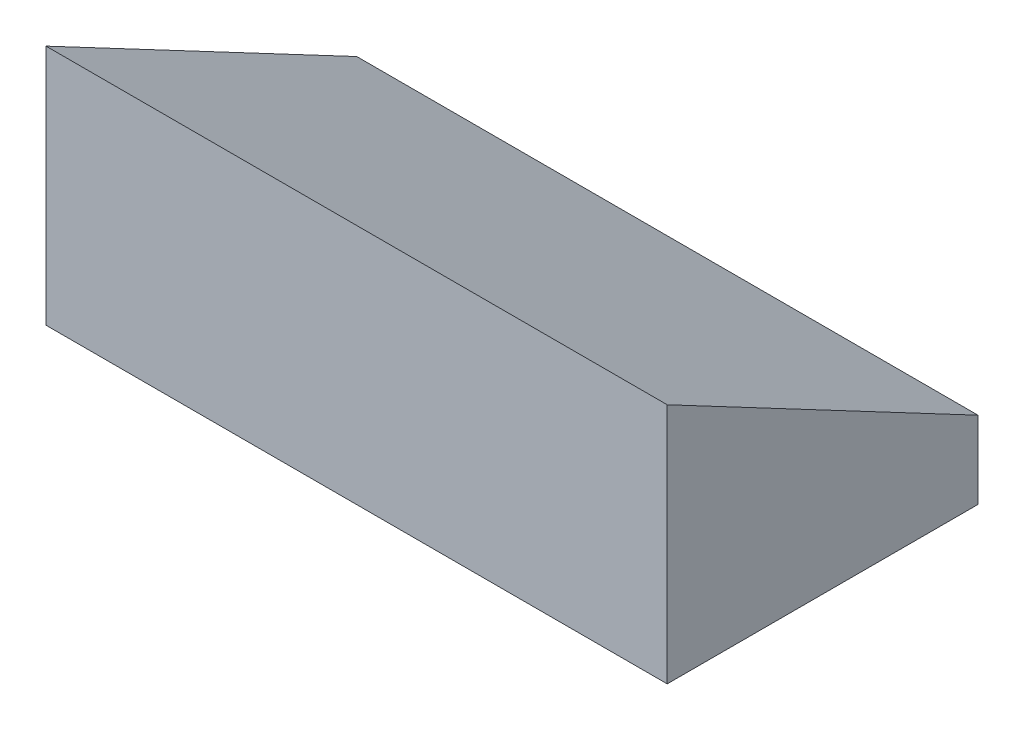
ISO-10303-21;
HEADER;
FILE_DESCRIPTION(('STEP AP214'),'2;1');
FILE_NAME('part.step','',(''),(''),'','','');
FILE_SCHEMA(('AUTOMOTIVE_DESIGN { 1 0 10303 214 1 1 1 1 }'));
ENDSEC;
DATA;
#1=APPLICATION_CONTEXT('core data for automotive mechanical design processes');
#2=APPLICATION_PROTOCOL_DEFINITION('international standard','automotive_design',2000,#1);
#3=PRODUCT_CONTEXT('',#1,'mechanical');
#4=PRODUCT('Part','Part','',(#3));
#5=PRODUCT_RELATED_PRODUCT_CATEGORY('part','',(#4));
#6=PRODUCT_DEFINITION_FORMATION('','',#4);
#7=PRODUCT_DEFINITION_CONTEXT('part definition',#1,'design');
#8=PRODUCT_DEFINITION('design','',#6,#7);
#9=PRODUCT_DEFINITION_SHAPE('','',#8);
#10=(LENGTH_UNIT() NAMED_UNIT(*) SI_UNIT(.MILLI.,.METRE.));
#11=(NAMED_UNIT(*) PLANE_ANGLE_UNIT() SI_UNIT($,.RADIAN.));
#12=(NAMED_UNIT(*) SI_UNIT($,.STERADIAN.) SOLID_ANGLE_UNIT());
#13=UNCERTAINTY_MEASURE_WITH_UNIT(LENGTH_MEASURE(1.E-05),#10,'distance_accuracy_value','');
#14=(GEOMETRIC_REPRESENTATION_CONTEXT(3) GLOBAL_UNCERTAINTY_ASSIGNED_CONTEXT((#13)) GLOBAL_UNIT_ASSIGNED_CONTEXT((#10,
#11,#12)) REPRESENTATION_CONTEXT('',''));
#15=CARTESIAN_POINT('',(0.,0.,0.));
#16=DIRECTION('',(0.,0.,1.));
#17=DIRECTION('',(1.,0.,0.));
#18=AXIS2_PLACEMENT_3D('',#15,#16,#17);
#19=CARTESIAN_POINT('',(15.83,0.,0.));
#20=DIRECTION('',(0.,1.,0.));
#21=DIRECTION('',(0.,0.,1.));
#22=AXIS2_PLACEMENT_3D('',#19,#20,#21);
#23=PLANE('',#22);
#24=DIRECTION('',(0.,0.,-1.));
#25=VECTOR('',#24,1.);
#26=CARTESIAN_POINT('',(0.,0.,0.));
#27=LINE('',#26,#25);
#28=CARTESIAN_POINT('',(0.,0.,0.));
#29=VERTEX_POINT('',#28);
#30=CARTESIAN_POINT('',(0.,0.,-7.92));
#31=VERTEX_POINT('',#30);
#32=EDGE_CURVE('E143',#29,#31,#27,.T.);
#33=ORIENTED_EDGE('',*,*,#32,.T.);
#34=DIRECTION('',(-1.,0.,0.));
#35=VECTOR('',#34,1.);
#36=CARTESIAN_POINT('',(15.83,0.,-7.92));
#37=LINE('',#36,#35);
#38=CARTESIAN_POINT('',(15.83,0.,-7.92));
#39=VERTEX_POINT('',#38);
#40=EDGE_CURVE('E40',#39,#31,#37,.T.);
#41=ORIENTED_EDGE('',*,*,#40,.F.);
#42=DIRECTION('',(0.,0.,-1.));
#43=VECTOR('',#42,1.);
#44=CARTESIAN_POINT('',(15.83,0.,0.));
#45=LINE('',#44,#43);
#46=CARTESIAN_POINT('',(15.83,0.,0.));
#47=VERTEX_POINT('',#46);
#48=EDGE_CURVE('E149',#47,#39,#45,.T.);
#49=ORIENTED_EDGE('',*,*,#48,.F.);
#50=DIRECTION('',(-1.,0.,0.));
#51=VECTOR('',#50,1.);
#52=CARTESIAN_POINT('',(15.83,0.,0.));
#53=LINE('',#52,#51);
#54=EDGE_CURVE('E155',#47,#29,#53,.T.);
#55=ORIENTED_EDGE('',*,*,#54,.T.);
#56=EDGE_LOOP('',(#33,#41,#49,#55));
#57=FACE_BOUND('',#56,.T.);
#58=DIRECTION('',(0.,0.,-1.));
#59=VECTOR('',#58,1.);
#60=CARTESIAN_POINT('',(1.5,0.,0.));
#61=LINE('',#60,#59);
#62=CARTESIAN_POINT('',(1.5,0.,-1.5));
#63=VERTEX_POINT('',#62);
#64=CARTESIAN_POINT('',(1.5,0.,-6.42));
#65=VERTEX_POINT('',#64);
#66=EDGE_CURVE('E114',#63,#65,#61,.T.);
#67=ORIENTED_EDGE('',*,*,#66,.F.);
#68=DIRECTION('',(-1.,0.,0.));
#69=VECTOR('',#68,1.);
#70=CARTESIAN_POINT('',(15.83,0.,-1.5));
#71=LINE('',#70,#69);
#72=CARTESIAN_POINT('',(14.33,0.,-1.5));
#73=VERTEX_POINT('',#72);
#74=EDGE_CURVE('E137',#73,#63,#71,.T.);
#75=ORIENTED_EDGE('',*,*,#74,.F.);
#76=DIRECTION('',(0.,0.,-1.));
#77=VECTOR('',#76,1.);
#78=CARTESIAN_POINT('',(14.33,0.,0.));
#79=LINE('',#78,#77);
#80=CARTESIAN_POINT('',(14.33,0.,-6.42));
#81=VERTEX_POINT('',#80);
#82=EDGE_CURVE('E47',#73,#81,#79,.T.);
#83=ORIENTED_EDGE('',*,*,#82,.T.);
#84=DIRECTION('',(-1.,0.,0.));
#85=VECTOR('',#84,1.);
#86=CARTESIAN_POINT('',(15.83,0.,-6.42));
#87=LINE('',#86,#85);
#88=EDGE_CURVE('E125',#81,#65,#87,.T.);
#89=ORIENTED_EDGE('',*,*,#88,.T.);
#90=EDGE_LOOP('',(#67,#75,#83,#89));
#91=FACE_BOUND('',#90,.T.);
#92=ADVANCED_FACE('F33',(#57,#91),#23,.F.);
#93=CARTESIAN_POINT('',(15.83,0.,-7.92));
#94=DIRECTION('',(0.,0.,1.));
#95=DIRECTION('',(1.,0.,0.));
#96=AXIS2_PLACEMENT_3D('',#93,#94,#95);
#97=PLANE('',#96);
#98=DIRECTION('',(0.,1.,0.));
#99=VECTOR('',#98,1.);
#100=CARTESIAN_POINT('',(0.,0.,-7.92));
#101=LINE('',#100,#99);
#102=CARTESIAN_POINT('',(0.,1.97,-7.92));
#103=VERTEX_POINT('',#102);
#104=EDGE_CURVE('E158',#31,#103,#101,.T.);
#105=ORIENTED_EDGE('',*,*,#104,.T.);
#106=DIRECTION('',(-1.,0.,0.));
#107=VECTOR('',#106,1.);
#108=CARTESIAN_POINT('',(15.83,1.97,-7.92));
#109=LINE('',#108,#107);
#110=CARTESIAN_POINT('',(15.83,1.97,-7.92));
#111=VERTEX_POINT('',#110);
#112=EDGE_CURVE('E166',#111,#103,#109,.T.);
#113=ORIENTED_EDGE('',*,*,#112,.F.);
#114=DIRECTION('',(0.,1.,0.));
#115=VECTOR('',#114,1.);
#116=CARTESIAN_POINT('',(15.83,0.,-7.92));
#117=LINE('',#116,#115);
#118=EDGE_CURVE('E85',#39,#111,#117,.T.);
#119=ORIENTED_EDGE('',*,*,#118,.F.);
#120=ORIENTED_EDGE('',*,*,#40,.T.);
#121=EDGE_LOOP('',(#105,#113,#119,#120));
#122=FACE_BOUND('',#121,.T.);
#123=ADVANCED_FACE('F169',(#122),#97,.F.);
#124=CARTESIAN_POINT('',(15.83,1.97,-7.92));
#125=DIRECTION('',(0.,-0.883923616812411,0.467631307379293));
#126=DIRECTION('',(0.,-0.467631307379293,-0.883923616812411));
#127=AXIS2_PLACEMENT_3D('',#124,#125,#126);
#128=PLANE('',#127);
#129=DIRECTION('',(0.,0.467631307379293,0.883923616812411));
#130=VECTOR('',#129,1.);
#131=CARTESIAN_POINT('',(0.,1.97,-7.92));
#132=LINE('',#131,#130);
#133=CARTESIAN_POINT('',(0.,6.16,0.));
#134=VERTEX_POINT('',#133);
#135=EDGE_CURVE('E160',#103,#134,#132,.T.);
#136=ORIENTED_EDGE('',*,*,#135,.T.);
#137=DIRECTION('',(-1.,0.,0.));
#138=VECTOR('',#137,1.);
#139=CARTESIAN_POINT('',(15.83,6.16,0.));
#140=LINE('',#139,#138);
#141=CARTESIAN_POINT('',(15.83,6.16,0.));
#142=VERTEX_POINT('',#141);
#143=EDGE_CURVE('E164',#142,#134,#140,.T.);
#144=ORIENTED_EDGE('',*,*,#143,.F.);
#145=DIRECTION('',(0.,0.467631307379293,0.883923616812411));
#146=VECTOR('',#145,1.);
#147=CARTESIAN_POINT('',(15.83,1.97,-7.92));
#148=LINE('',#147,#146);
#149=EDGE_CURVE('E152',#111,#142,#148,.T.);
#150=ORIENTED_EDGE('',*,*,#149,.F.);
#151=ORIENTED_EDGE('',*,*,#112,.T.);
#152=EDGE_LOOP('',(#136,#144,#150,#151));
#153=FACE_BOUND('',#152,.T.);
#154=ADVANCED_FACE('F179',(#153),#128,.F.);
#155=CARTESIAN_POINT('',(15.83,0.,0.));
#156=DIRECTION('',(0.,0.,-1.));
#157=DIRECTION('',(-1.,0.,0.));
#158=AXIS2_PLACEMENT_3D('',#155,#156,#157);
#159=PLANE('',#158);
#160=DIRECTION('',(0.,-1.,0.));
#161=VECTOR('',#160,1.);
#162=CARTESIAN_POINT('',(0.,0.,0.));
#163=LINE('',#162,#161);
#164=EDGE_CURVE('E77',#134,#29,#163,.T.);
#165=ORIENTED_EDGE('',*,*,#164,.T.);
#166=ORIENTED_EDGE('',*,*,#54,.F.);
#167=DIRECTION('',(0.,-1.,0.));
#168=VECTOR('',#167,1.);
#169=CARTESIAN_POINT('',(15.83,0.,0.));
#170=LINE('',#169,#168);
#171=EDGE_CURVE('E56',#142,#47,#170,.T.);
#172=ORIENTED_EDGE('',*,*,#171,.F.);
#173=ORIENTED_EDGE('',*,*,#143,.T.);
#174=EDGE_LOOP('',(#165,#166,#172,#173));
#175=FACE_BOUND('',#174,.T.);
#176=ADVANCED_FACE('F181',(#175),#159,.F.);
#177=CARTESIAN_POINT('',(15.83,0.,0.));
#178=DIRECTION('',(1.,0.,0.));
#179=DIRECTION('',(0.,0.,-1.));
#180=AXIS2_PLACEMENT_3D('',#177,#178,#179);
#181=PLANE('',#180);
#182=ORIENTED_EDGE('',*,*,#48,.T.);
#183=ORIENTED_EDGE('',*,*,#118,.T.);
#184=ORIENTED_EDGE('',*,*,#149,.T.);
#185=ORIENTED_EDGE('',*,*,#171,.T.);
#186=EDGE_LOOP('',(#182,#183,#184,#185));
#187=FACE_BOUND('',#186,.T.);
#188=ADVANCED_FACE('F182',(#187),#181,.T.);
#189=CARTESIAN_POINT('',(0.,0.,0.));
#190=DIRECTION('',(1.,0.,0.));
#191=DIRECTION('',(0.,0.,-1.));
#192=AXIS2_PLACEMENT_3D('',#189,#190,#191);
#193=PLANE('',#192);
#194=ORIENTED_EDGE('',*,*,#32,.F.);
#195=ORIENTED_EDGE('',*,*,#164,.F.);
#196=ORIENTED_EDGE('',*,*,#135,.F.);
#197=ORIENTED_EDGE('',*,*,#104,.F.);
#198=EDGE_LOOP('',(#194,#195,#196,#197));
#199=FACE_BOUND('',#198,.T.);
#200=ADVANCED_FACE('F175',(#199),#193,.F.);
#201=CARTESIAN_POINT('',(15.83,0.,-6.42));
#202=DIRECTION('',(0.,0.,1.));
#203=DIRECTION('',(1.,0.,0.));
#204=AXIS2_PLACEMENT_3D('',#201,#202,#203);
#205=PLANE('',#204);
#206=DIRECTION('',(0.,1.,0.));
#207=VECTOR('',#206,1.);
#208=CARTESIAN_POINT('',(1.5,0.,-6.42));
#209=LINE('',#208,#207);
#210=CARTESIAN_POINT('',(1.5,1.06658139714516,-6.42));
#211=VERTEX_POINT('',#210);
#212=EDGE_CURVE('E107',#65,#211,#209,.T.);
#213=ORIENTED_EDGE('',*,*,#212,.F.);
#214=ORIENTED_EDGE('',*,*,#88,.F.);
#215=DIRECTION('',(0.,1.,0.));
#216=VECTOR('',#215,1.);
#217=CARTESIAN_POINT('',(14.33,0.,-6.42));
#218=LINE('',#217,#216);
#219=CARTESIAN_POINT('',(14.33,1.06658139714516,-6.42));
#220=VERTEX_POINT('',#219);
#221=EDGE_CURVE('E122',#81,#220,#218,.T.);
#222=ORIENTED_EDGE('',*,*,#221,.T.);
#223=DIRECTION('',(-1.,0.,0.));
#224=VECTOR('',#223,1.);
#225=CARTESIAN_POINT('',(15.83,1.06658139714516,-6.42));
#226=LINE('',#225,#224);
#227=EDGE_CURVE('E120',#220,#211,#226,.T.);
#228=ORIENTED_EDGE('',*,*,#227,.T.);
#229=EDGE_LOOP('',(#213,#214,#222,#228));
#230=FACE_BOUND('',#229,.T.);
#231=ADVANCED_FACE('F121',(#230),#205,.T.);
#232=CARTESIAN_POINT('',(15.83,0.644114574781384,-7.21855303893106));
#233=DIRECTION('',(0.,-0.883923616812411,0.467631307379293));
#234=DIRECTION('',(0.,-0.467631307379293,-0.883923616812411));
#235=AXIS2_PLACEMENT_3D('',#232,#233,#234);
#236=PLANE('',#235);
#237=CARTESIAN_POINT('',(7.915,2.36802079108456,-3.96));
#238=DIRECTION('',(0.,-0.883923616812411,0.467631307379293));
#239=DIRECTION('',(0.,-0.467631307379293,-0.883923616812411));
#240=AXIS2_PLACEMENT_3D('',#237,#238,#239);
#241=ELLIPSE('',#240,1.69697920891544,1.5);
#242=CARTESIAN_POINT('',(7.915,1.57446018502395,-5.46));
#243=VERTEX_POINT('',#242);
#244=EDGE_CURVE('E312',#243,#243,#241,.T.);
#245=ORIENTED_EDGE('',*,*,#244,.F.);
#246=EDGE_LOOP('',(#245));
#247=FACE_BOUND('',#246,.T.);
#248=DIRECTION('',(0.,0.467631307379293,0.883923616812411));
#249=VECTOR('',#248,1.);
#250=CARTESIAN_POINT('',(1.5,0.644114574781384,-7.21855303893106));
#251=LINE('',#250,#249);
#252=CARTESIAN_POINT('',(1.5,3.66946018502395,-1.5));
#253=VERTEX_POINT('',#252);
#254=EDGE_CURVE('E111',#211,#253,#251,.T.);
#255=ORIENTED_EDGE('',*,*,#254,.F.);
#256=ORIENTED_EDGE('',*,*,#227,.F.);
#257=DIRECTION('',(0.,0.467631307379293,0.883923616812411));
#258=VECTOR('',#257,1.);
#259=CARTESIAN_POINT('',(14.33,0.644114574781384,-7.21855303893106));
#260=LINE('',#259,#258);
#261=CARTESIAN_POINT('',(14.33,3.66946018502395,-1.5));
#262=VERTEX_POINT('',#261);
#263=EDGE_CURVE('E138',#220,#262,#260,.T.);
#264=ORIENTED_EDGE('',*,*,#263,.T.);
#265=DIRECTION('',(-1.,0.,0.));
#266=VECTOR('',#265,1.);
#267=CARTESIAN_POINT('',(15.83,3.66946018502395,-1.5));
#268=LINE('',#267,#266);
#269=EDGE_CURVE('E126',#262,#253,#268,.T.);
#270=ORIENTED_EDGE('',*,*,#269,.T.);
#271=EDGE_LOOP('',(#255,#256,#264,#270));
#272=FACE_BOUND('',#271,.T.);
#273=ADVANCED_FACE('F128',(#247,#272),#236,.T.);
#274=CARTESIAN_POINT('',(15.83,0.,-1.5));
#275=DIRECTION('',(0.,0.,-1.));
#276=DIRECTION('',(-1.,0.,0.));
#277=AXIS2_PLACEMENT_3D('',#274,#275,#276);
#278=PLANE('',#277);
#279=DIRECTION('',(0.,-1.,0.));
#280=VECTOR('',#279,1.);
#281=CARTESIAN_POINT('',(1.5,0.,-1.5));
#282=LINE('',#281,#280);
#283=EDGE_CURVE('E131',#253,#63,#282,.T.);
#284=ORIENTED_EDGE('',*,*,#283,.F.);
#285=ORIENTED_EDGE('',*,*,#269,.F.);
#286=DIRECTION('',(0.,-1.,0.));
#287=VECTOR('',#286,1.);
#288=CARTESIAN_POINT('',(14.33,0.,-1.5));
#289=LINE('',#288,#287);
#290=EDGE_CURVE('E139',#262,#73,#289,.T.);
#291=ORIENTED_EDGE('',*,*,#290,.T.);
#292=ORIENTED_EDGE('',*,*,#74,.T.);
#293=EDGE_LOOP('',(#284,#285,#291,#292));
#294=FACE_BOUND('',#293,.T.);
#295=ADVANCED_FACE('F235',(#294),#278,.T.);
#296=CARTESIAN_POINT('',(14.33,0.,0.));
#297=DIRECTION('',(1.,0.,0.));
#298=DIRECTION('',(0.,0.,-1.));
#299=AXIS2_PLACEMENT_3D('',#296,#297,#298);
#300=PLANE('',#299);
#301=ORIENTED_EDGE('',*,*,#82,.F.);
#302=ORIENTED_EDGE('',*,*,#290,.F.);
#303=ORIENTED_EDGE('',*,*,#263,.F.);
#304=ORIENTED_EDGE('',*,*,#221,.F.);
#305=EDGE_LOOP('',(#301,#302,#303,#304));
#306=FACE_BOUND('',#305,.T.);
#307=ADVANCED_FACE('F240',(#306),#300,.F.);
#308=CARTESIAN_POINT('',(1.5,0.,0.));
#309=DIRECTION('',(1.,0.,0.));
#310=DIRECTION('',(0.,0.,-1.));
#311=AXIS2_PLACEMENT_3D('',#308,#309,#310);
#312=PLANE('',#311);
#313=ORIENTED_EDGE('',*,*,#66,.T.);
#314=ORIENTED_EDGE('',*,*,#212,.T.);
#315=ORIENTED_EDGE('',*,*,#254,.T.);
#316=ORIENTED_EDGE('',*,*,#283,.T.);
#317=EDGE_LOOP('',(#313,#314,#315,#316));
#318=FACE_BOUND('',#317,.T.);
#319=ADVANCED_FACE('F109',(#318),#312,.T.);
#320=CARTESIAN_POINT('',(7.915,0.,-3.96));
#321=DIRECTION('',(0.,1.,0.));
#322=DIRECTION('',(0.,0.,1.));
#323=AXIS2_PLACEMENT_3D('',#320,#321,#322);
#324=PLANE('',#323);
#325=CARTESIAN_POINT('',(7.915,0.,-3.96));
#326=DIRECTION('',(0.,1.,0.));
#327=DIRECTION('',(0.,0.,1.));
#328=AXIS2_PLACEMENT_3D('',#325,#326,#327);
#329=CIRCLE('',#328,1.5);
#330=CARTESIAN_POINT('',(7.915,0.,-2.46));
#331=VERTEX_POINT('',#330);
#332=EDGE_CURVE('E148',#331,#331,#329,.T.);
#333=ORIENTED_EDGE('',*,*,#332,.F.);
#334=EDGE_LOOP('',(#333));
#335=FACE_BOUND('',#334,.T.);
#336=CARTESIAN_POINT('',(7.915,0.,-3.96));
#337=DIRECTION('',(0.,1.,0.));
#338=DIRECTION('',(0.,0.,1.));
#339=AXIS2_PLACEMENT_3D('',#336,#337,#338);
#340=CIRCLE('',#339,0.670000000000001);
#341=CARTESIAN_POINT('',(7.915,0.,-3.29));
#342=VERTEX_POINT('',#341);
#343=EDGE_CURVE('E310',#342,#342,#340,.T.);
#344=ORIENTED_EDGE('',*,*,#343,.T.);
#345=EDGE_LOOP('',(#344));
#346=FACE_BOUND('',#345,.T.);
#347=ADVANCED_FACE('F258',(#335,#346),#324,.F.);
#348=CARTESIAN_POINT('',(7.915,6.88923214695758,-3.96));
#349=DIRECTION('',(0.,-1.,0.));
#350=DIRECTION('',(0.,0.,-1.));
#351=AXIS2_PLACEMENT_3D('',#348,#349,#350);
#352=CYLINDRICAL_SURFACE('',#351,1.5);
#353=ORIENTED_EDGE('',*,*,#244,.T.);
#354=EDGE_LOOP('',(#353));
#355=FACE_BOUND('',#354,.T.);
#356=ORIENTED_EDGE('',*,*,#332,.T.);
#357=EDGE_LOOP('',(#356));
#358=FACE_BOUND('',#357,.T.);
#359=ADVANCED_FACE('F275',(#355,#358),#352,.T.);
#360=CARTESIAN_POINT('',(7.915,6.88923214695758,-3.96));
#361=DIRECTION('',(0.,-1.,0.));
#362=DIRECTION('',(0.,0.,-1.));
#363=AXIS2_PLACEMENT_3D('',#360,#361,#362);
#364=CYLINDRICAL_SURFACE('',#363,0.670000000000001);
#365=CARTESIAN_POINT('',(7.915,2.36802079108456,-3.96));
#366=DIRECTION('',(0.,-0.883923616812411,0.467631307379293));
#367=DIRECTION('',(0.,-0.467631307379293,-0.883923616812411));
#368=AXIS2_PLACEMENT_3D('',#365,#366,#367);
#369=ELLIPSE('',#368,0.757984046648898,0.670000000000001);
#370=CARTESIAN_POINT('',(7.915,2.01356372037749,-4.63));
#371=VERTEX_POINT('',#370);
#372=EDGE_CURVE('E11',#371,#371,#369,.F.);
#373=ORIENTED_EDGE('',*,*,#372,.T.);
#374=EDGE_LOOP('',(#373));
#375=FACE_BOUND('',#374,.T.);
#376=ORIENTED_EDGE('',*,*,#343,.F.);
#377=EDGE_LOOP('',(#376));
#378=FACE_BOUND('',#377,.T.);
#379=ADVANCED_FACE('F285',(#375,#378),#364,.F.);
#380=ORIENTED_EDGE('',*,*,#372,.F.);
#381=EDGE_LOOP('',(#380));
#382=FACE_BOUND('',#381,.T.);
#383=ADVANCED_FACE('F268',(#382),#236,.T.);
#384=CLOSED_SHELL('',(#92,#123,#154,#176,#188,#200,#231,#273,#295,#307,#319,#347,#359,#379,#383));
#385=MANIFOLD_SOLID_BREP('B2',#384);
#386=ADVANCED_BREP_SHAPE_REPRESENTATION('',(#18,#385),#14);
#387=SHAPE_DEFINITION_REPRESENTATION(#9,#386);
ENDSEC;
END-ISO-10303-21;
